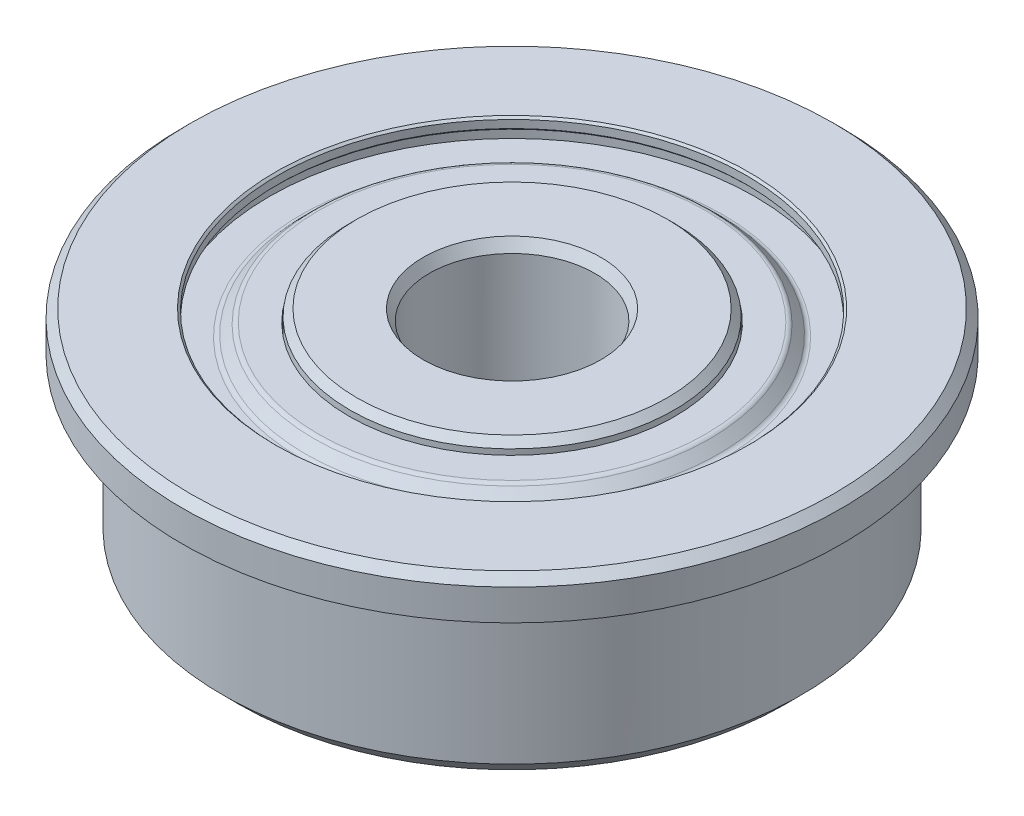
ISO-10303-21;
HEADER;
FILE_DESCRIPTION(('STEP AP214'),'2;1');
FILE_NAME('part.step','',(''),(''),'','','');
FILE_SCHEMA(('AUTOMOTIVE_DESIGN { 1 0 10303 214 1 1 1 1 }'));
ENDSEC;
DATA;
#1=APPLICATION_CONTEXT('core data for automotive mechanical design processes');
#2=APPLICATION_PROTOCOL_DEFINITION('international standard','automotive_design',2000,#1);
#3=PRODUCT_CONTEXT('',#1,'mechanical');
#4=PRODUCT('Part','Part','',(#3));
#5=PRODUCT_RELATED_PRODUCT_CATEGORY('part','',(#4));
#6=PRODUCT_DEFINITION_FORMATION('','',#4);
#7=PRODUCT_DEFINITION_CONTEXT('part definition',#1,'design');
#8=PRODUCT_DEFINITION('design','',#6,#7);
#9=PRODUCT_DEFINITION_SHAPE('','',#8);
#10=(LENGTH_UNIT() NAMED_UNIT(*) SI_UNIT(.MILLI.,.METRE.));
#11=(NAMED_UNIT(*) PLANE_ANGLE_UNIT() SI_UNIT($,.RADIAN.));
#12=(NAMED_UNIT(*) SI_UNIT($,.STERADIAN.) SOLID_ANGLE_UNIT());
#13=UNCERTAINTY_MEASURE_WITH_UNIT(LENGTH_MEASURE(1.E-05),#10,'distance_accuracy_value','');
#14=(GEOMETRIC_REPRESENTATION_CONTEXT(3) GLOBAL_UNCERTAINTY_ASSIGNED_CONTEXT((#13)) GLOBAL_UNIT_ASSIGNED_CONTEXT((#10,
#11,#12)) REPRESENTATION_CONTEXT('',''));
#15=CARTESIAN_POINT('',(0.,0.,0.));
#16=DIRECTION('',(0.,0.,1.));
#17=DIRECTION('',(1.,0.,0.));
#18=AXIS2_PLACEMENT_3D('',#15,#16,#17);
#19=CARTESIAN_POINT('',(0.,0.544,0.));
#20=DIRECTION('',(0.,-1.,0.));
#21=DIRECTION('',(0.,0.,-1.));
#22=AXIS2_PLACEMENT_3D('',#19,#20,#21);
#23=PLANE('',#22);
#24=CARTESIAN_POINT('',(0.,0.544,0.));
#25=DIRECTION('',(0.,-1.,0.));
#26=DIRECTION('',(0.,0.,-1.));
#27=AXIS2_PLACEMENT_3D('',#24,#25,#26);
#28=CIRCLE('',#27,3.94192694773615);
#29=CARTESIAN_POINT('',(0.,0.544,-3.94192694773615));
#30=VERTEX_POINT('',#29);
#31=EDGE_CURVE('E388',#30,#30,#28,.T.);
#32=ORIENTED_EDGE('',*,*,#31,.T.);
#33=EDGE_LOOP('',(#32));
#34=FACE_BOUND('',#33,.T.);
#35=CARTESIAN_POINT('',(0.,0.544,0.));
#36=DIRECTION('',(0.,-1.,0.));
#37=DIRECTION('',(0.,0.,-1.));
#38=AXIS2_PLACEMENT_3D('',#35,#36,#37);
#39=CIRCLE('',#38,3.92);
#40=CARTESIAN_POINT('',(0.,0.544,-3.92));
#41=VERTEX_POINT('',#40);
#42=EDGE_CURVE('E390',#41,#41,#39,.T.);
#43=ORIENTED_EDGE('',*,*,#42,.F.);
#44=EDGE_LOOP('',(#43));
#45=FACE_BOUND('',#44,.T.);
#46=ADVANCED_FACE('F16',(#34,#45),#23,.T.);
#47=CARTESIAN_POINT('',(0.,0.3,0.));
#48=DIRECTION('',(0.,-1.,0.));
#49=DIRECTION('',(0.,0.,-1.));
#50=AXIS2_PLACEMENT_3D('',#47,#48,#49);
#51=CYLINDRICAL_SURFACE('',#50,3.92);
#52=ORIENTED_EDGE('',*,*,#42,.T.);
#53=EDGE_LOOP('',(#52));
#54=FACE_BOUND('',#53,.T.);
#55=CARTESIAN_POINT('',(0.,0.170000000025539,0.));
#56=DIRECTION('',(0.,1.,0.));
#57=DIRECTION('',(0.,0.,1.));
#58=AXIS2_PLACEMENT_3D('',#55,#56,#57);
#59=CIRCLE('',#58,3.91999999999371);
#60=CARTESIAN_POINT('',(0.,0.170000000025539,3.91999999999371));
#61=VERTEX_POINT('',#60);
#62=EDGE_CURVE('E77',#61,#61,#59,.F.);
#63=ORIENTED_EDGE('',*,*,#62,.F.);
#64=EDGE_LOOP('',(#63));
#65=FACE_BOUND('',#64,.T.);
#66=ADVANCED_FACE('F114',(#54,#65),#51,.T.);
#67=CARTESIAN_POINT('',(0.,0.544,0.));
#68=DIRECTION('',(0.,-1.,0.));
#69=DIRECTION('',(0.,0.,-1.));
#70=AXIS2_PLACEMENT_3D('',#67,#68,#69);
#71=CYLINDRICAL_SURFACE('',#70,3.94192694773615);
#72=ORIENTED_EDGE('',*,*,#31,.F.);
#73=EDGE_LOOP('',(#72));
#74=FACE_BOUND('',#73,.T.);
#75=CARTESIAN_POINT('',(0.,0.3,0.));
#76=DIRECTION('',(0.,-1.,0.));
#77=DIRECTION('',(0.,0.,-1.));
#78=AXIS2_PLACEMENT_3D('',#75,#76,#77);
#79=CIRCLE('',#78,3.94192694773615);
#80=CARTESIAN_POINT('',(0.,0.3,-3.94192694773615));
#81=VERTEX_POINT('',#80);
#82=EDGE_CURVE('E385',#81,#81,#79,.F.);
#83=ORIENTED_EDGE('',*,*,#82,.F.);
#84=EDGE_LOOP('',(#83));
#85=FACE_BOUND('',#84,.T.);
#86=ADVANCED_FACE('F111',(#74,#85),#71,.F.);
#87=CARTESIAN_POINT('',(0.,0.170000000025539,0.));
#88=DIRECTION('',(0.,1.,0.));
#89=DIRECTION('',(0.,0.,1.));
#90=AXIS2_PLACEMENT_3D('',#87,#88,#89);
#91=CONICAL_SURFACE('',#90,3.91999999999371,0.785398163397448);
#92=CARTESIAN_POINT('',(0.,5.6843418860808E-11,0.));
#93=DIRECTION('',(0.,1.,0.));
#94=DIRECTION('',(0.,0.,1.));
#95=AXIS2_PLACEMENT_3D('',#92,#93,#94);
#96=CIRCLE('',#95,3.75000000002501);
#97=CARTESIAN_POINT('',(0.,5.6843418860808E-11,3.75000000002501));
#98=VERTEX_POINT('',#97);
#99=EDGE_CURVE('E63',#98,#98,#96,.T.);
#100=ORIENTED_EDGE('',*,*,#99,.T.);
#101=EDGE_LOOP('',(#100));
#102=FACE_BOUND('',#101,.T.);
#103=ORIENTED_EDGE('',*,*,#62,.T.);
#104=EDGE_LOOP('',(#103));
#105=FACE_BOUND('',#104,.T.);
#106=ADVANCED_FACE('F106',(#102,#105),#91,.T.);
#107=CARTESIAN_POINT('',(0.,0.3,0.));
#108=DIRECTION('',(0.,-1.,0.));
#109=DIRECTION('',(0.,0.,-1.));
#110=AXIS2_PLACEMENT_3D('',#107,#108,#109);
#111=PLANE('',#110);
#112=ORIENTED_EDGE('',*,*,#82,.T.);
#113=EDGE_LOOP('',(#112));
#114=FACE_BOUND('',#113,.T.);
#115=CARTESIAN_POINT('',(0.,0.3,0.));
#116=DIRECTION('',(0.,1.,0.));
#117=DIRECTION('',(0.,0.,1.));
#118=AXIS2_PLACEMENT_3D('',#115,#116,#117);
#119=CIRCLE('',#118,4.68490365463214);
#120=CARTESIAN_POINT('',(0.,0.3,4.68490365463214));
#121=VERTEX_POINT('',#120);
#122=CARTESIAN_POINT('',(0.,0.3,-4.68490365463214));
#123=VERTEX_POINT('',#122);
#124=EDGE_CURVE('E61',#121,#123,#119,.T.);
#125=ORIENTED_EDGE('',*,*,#124,.F.);
#126=CARTESIAN_POINT('',(0.,0.3,0.));
#127=DIRECTION('',(0.,1.,0.));
#128=DIRECTION('',(0.,0.,-1.));
#129=AXIS2_PLACEMENT_3D('',#126,#127,#128);
#130=CIRCLE('',#129,4.68490365463214);
#131=EDGE_CURVE('E56',#123,#121,#130,.T.);
#132=ORIENTED_EDGE('',*,*,#131,.F.);
#133=EDGE_LOOP('',(#125,#132));
#134=FACE_BOUND('',#133,.T.);
#135=ADVANCED_FACE('F60',(#114,#134),#111,.T.);
#136=CARTESIAN_POINT('',(0.,0.,0.));
#137=DIRECTION('',(0.,1.,0.));
#138=DIRECTION('',(0.,0.,1.));
#139=AXIS2_PLACEMENT_3D('',#136,#137,#138);
#140=PLANE('',#139);
#141=CARTESIAN_POINT('',(0.,5.6843418860808E-11,0.));
#142=DIRECTION('',(0.,-1.,0.));
#143=DIRECTION('',(0.,0.,-1.));
#144=AXIS2_PLACEMENT_3D('',#141,#142,#143);
#145=CIRCLE('',#144,2.1499999999719);
#146=CARTESIAN_POINT('',(0.,5.6843418860808E-11,-2.1499999999719));
#147=VERTEX_POINT('',#146);
#148=EDGE_CURVE('E69',#147,#147,#145,.F.);
#149=ORIENTED_EDGE('',*,*,#148,.T.);
#150=EDGE_LOOP('',(#149));
#151=FACE_BOUND('',#150,.T.);
#152=ORIENTED_EDGE('',*,*,#99,.F.);
#153=EDGE_LOOP('',(#152));
#154=FACE_BOUND('',#153,.T.);
#155=ADVANCED_FACE('F89',(#151,#154),#140,.F.);
#156=CARTESIAN_POINT('',(0.,0.45,0.));
#157=DIRECTION('',(0.,-1.,0.));
#158=DIRECTION('',(0.,0.,-1.));
#159=AXIS2_PLACEMENT_3D('',#156,#157,#158);
#160=TOROIDAL_SURFACE('',#159,4.68490365463214,0.15);
#161=ORIENTED_EDGE('',*,*,#131,.T.);
#162=ORIENTED_EDGE('',*,*,#124,.T.);
#163=EDGE_LOOP('',(#161,#162));
#164=FACE_BOUND('',#163,.T.);
#165=CARTESIAN_POINT('',(0.,0.343933982833278,0.));
#166=DIRECTION('',(0.,1.,0.));
#167=DIRECTION('',(0.,0.,1.));
#168=AXIS2_PLACEMENT_3D('',#165,#166,#167);
#169=CIRCLE('',#168,4.79096967177384);
#170=CARTESIAN_POINT('',(0.,0.343933982833278,4.79096967177384));
#171=VERTEX_POINT('',#170);
#172=EDGE_CURVE('E94',#171,#171,#169,.T.);
#173=ORIENTED_EDGE('',*,*,#172,.F.);
#174=EDGE_LOOP('',(#173));
#175=FACE_BOUND('',#174,.T.);
#176=ADVANCED_FACE('F67',(#164,#175),#160,.T.);
#177=CARTESIAN_POINT('',(0.,5.6843418860808E-11,0.));
#178=DIRECTION('',(0.,-1.,0.));
#179=DIRECTION('',(0.,0.,-1.));
#180=AXIS2_PLACEMENT_3D('',#177,#178,#179);
#181=CONICAL_SURFACE('',#180,2.1499999999719,0.523598775562543);
#182=CARTESIAN_POINT('',(0.,0.259807621135333,0.));
#183=DIRECTION('',(0.,1.,0.));
#184=DIRECTION('',(0.,0.,1.));
#185=AXIS2_PLACEMENT_3D('',#182,#183,#184);
#186=CIRCLE('',#185,2.);
#187=CARTESIAN_POINT('',(0.,0.259807621135333,2.));
#188=VERTEX_POINT('',#187);
#189=EDGE_CURVE('E368',#188,#188,#186,.T.);
#190=ORIENTED_EDGE('',*,*,#189,.T.);
#191=EDGE_LOOP('',(#190));
#192=FACE_BOUND('',#191,.T.);
#193=ORIENTED_EDGE('',*,*,#148,.F.);
#194=EDGE_LOOP('',(#193));
#195=FACE_BOUND('',#194,.T.);
#196=ADVANCED_FACE('F88',(#192,#195),#181,.F.);
#197=CARTESIAN_POINT('',(0.,0.546066017193425,0.));
#198=DIRECTION('',(0.,1.,0.));
#199=DIRECTION('',(0.,0.,1.));
#200=AXIS2_PLACEMENT_3D('',#197,#198,#199);
#201=CONICAL_SURFACE('',#200,4.99310170607714,0.785398163256839);
#202=CARTESIAN_POINT('',(0.,0.546066017177981,0.));
#203=DIRECTION('',(0.,-1.,0.));
#204=DIRECTION('',(0.,0.,-1.));
#205=AXIS2_PLACEMENT_3D('',#202,#203,#204);
#206=CIRCLE('',#205,4.99310170616609);
#207=CARTESIAN_POINT('',(0.,0.546066017177981,-4.99310170616609));
#208=VERTEX_POINT('',#207);
#209=EDGE_CURVE('E366',#208,#208,#206,.T.);
#210=ORIENTED_EDGE('',*,*,#209,.T.);
#211=EDGE_LOOP('',(#210));
#212=FACE_BOUND('',#211,.T.);
#213=ORIENTED_EDGE('',*,*,#172,.T.);
#214=EDGE_LOOP('',(#213));
#215=FACE_BOUND('',#214,.T.);
#216=ADVANCED_FACE('F418',(#212,#215),#201,.T.);
#217=CARTESIAN_POINT('',(0.,0.,0.));
#218=DIRECTION('',(0.,1.,0.));
#219=DIRECTION('',(0.,0.,1.));
#220=AXIS2_PLACEMENT_3D('',#217,#218,#219);
#221=CYLINDRICAL_SURFACE('',#220,2.);
#222=ORIENTED_EDGE('',*,*,#189,.F.);
#223=EDGE_LOOP('',(#222));
#224=FACE_BOUND('',#223,.T.);
#225=CARTESIAN_POINT('',(0.,4.74019237884704,0.));
#226=DIRECTION('',(0.,1.,0.));
#227=DIRECTION('',(0.,0.,1.));
#228=AXIS2_PLACEMENT_3D('',#225,#226,#227);
#229=CIRCLE('',#228,1.99999999995271);
#230=CARTESIAN_POINT('',(0.,4.74019237884704,1.99999999995271));
#231=VERTEX_POINT('',#230);
#232=EDGE_CURVE('E358',#231,#231,#229,.T.);
#233=ORIENTED_EDGE('',*,*,#232,.T.);
#234=EDGE_LOOP('',(#233));
#235=FACE_BOUND('',#234,.T.);
#236=ADVANCED_FACE('F345',(#224,#235),#221,.F.);
#237=CARTESIAN_POINT('',(0.,0.44,0.));
#238=DIRECTION('',(0.,-1.,0.));
#239=DIRECTION('',(0.,0.,-1.));
#240=AXIS2_PLACEMENT_3D('',#237,#238,#239);
#241=TOROIDAL_SURFACE('',#240,5.09916772334407,0.15);
#242=ORIENTED_EDGE('',*,*,#209,.F.);
#243=EDGE_LOOP('',(#242));
#244=FACE_BOUND('',#243,.T.);
#245=CARTESIAN_POINT('',(0.,0.59,0.));
#246=DIRECTION('',(0.,-1.,0.));
#247=DIRECTION('',(0.,0.,1.));
#248=AXIS2_PLACEMENT_3D('',#245,#246,#247);
#249=CIRCLE('',#248,5.09916772334407);
#250=CARTESIAN_POINT('',(0.,0.59,-5.09916772334407));
#251=VERTEX_POINT('',#250);
#252=CARTESIAN_POINT('',(0.,0.59,5.09916772334407));
#253=VERTEX_POINT('',#252);
#254=EDGE_CURVE('E308',#251,#253,#249,.F.);
#255=ORIENTED_EDGE('',*,*,#254,.F.);
#256=CARTESIAN_POINT('',(0.,0.59,0.));
#257=DIRECTION('',(0.,-1.,0.));
#258=DIRECTION('',(0.,0.,-1.));
#259=AXIS2_PLACEMENT_3D('',#256,#257,#258);
#260=CIRCLE('',#259,5.09916772334407);
#261=EDGE_CURVE('E764',#253,#251,#260,.F.);
#262=ORIENTED_EDGE('',*,*,#261,.F.);
#263=EDGE_LOOP('',(#255,#262));
#264=FACE_BOUND('',#263,.T.);
#265=ADVANCED_FACE('F341',(#244,#264),#241,.F.);
#266=CARTESIAN_POINT('',(0.,4.99999999999545,0.));
#267=DIRECTION('',(0.,1.,0.));
#268=DIRECTION('',(0.,0.,1.));
#269=AXIS2_PLACEMENT_3D('',#266,#267,#268);
#270=CONICAL_SURFACE('',#269,2.1499999999719,0.523598775631897);
#271=ORIENTED_EDGE('',*,*,#232,.F.);
#272=EDGE_LOOP('',(#271));
#273=FACE_BOUND('',#272,.T.);
#274=CARTESIAN_POINT('',(0.,4.99999999999545,0.));
#275=DIRECTION('',(0.,1.,0.));
#276=DIRECTION('',(0.,0.,1.));
#277=AXIS2_PLACEMENT_3D('',#274,#275,#276);
#278=CIRCLE('',#277,2.1499999999719);
#279=CARTESIAN_POINT('',(0.,4.99999999999545,2.1499999999719));
#280=VERTEX_POINT('',#279);
#281=EDGE_CURVE('E381',#280,#280,#278,.F.);
#282=ORIENTED_EDGE('',*,*,#281,.F.);
#283=EDGE_LOOP('',(#282));
#284=FACE_BOUND('',#283,.T.);
#285=ADVANCED_FACE('F325',(#273,#284),#270,.F.);
#286=CARTESIAN_POINT('',(0.,0.59,0.));
#287=DIRECTION('',(0.,-1.,0.));
#288=DIRECTION('',(0.,0.,-1.));
#289=AXIS2_PLACEMENT_3D('',#286,#287,#288);
#290=PLANE('',#289);
#291=CARTESIAN_POINT('',(0.,0.59,0.));
#292=DIRECTION('',(0.,-1.,0.));
#293=DIRECTION('',(0.,0.,-1.));
#294=AXIS2_PLACEMENT_3D('',#291,#292,#293);
#295=CIRCLE('',#294,5.875);
#296=CARTESIAN_POINT('',(0.,0.59,-5.875));
#297=VERTEX_POINT('',#296);
#298=EDGE_CURVE('E760',#297,#297,#295,.T.);
#299=ORIENTED_EDGE('',*,*,#298,.T.);
#300=EDGE_LOOP('',(#299));
#301=FACE_BOUND('',#300,.T.);
#302=ORIENTED_EDGE('',*,*,#254,.T.);
#303=ORIENTED_EDGE('',*,*,#261,.T.);
#304=EDGE_LOOP('',(#302,#303));
#305=FACE_BOUND('',#304,.T.);
#306=ADVANCED_FACE('F314',(#301,#305),#290,.T.);
#307=CARTESIAN_POINT('',(0.,5.,0.));
#308=DIRECTION('',(0.,1.,0.));
#309=DIRECTION('',(0.,0.,1.));
#310=AXIS2_PLACEMENT_3D('',#307,#308,#309);
#311=PLANE('',#310);
#312=ORIENTED_EDGE('',*,*,#281,.T.);
#313=EDGE_LOOP('',(#312));
#314=FACE_BOUND('',#313,.T.);
#315=CARTESIAN_POINT('',(0.,5.0000000000523,0.));
#316=DIRECTION('',(0.,-1.,0.));
#317=DIRECTION('',(0.,0.,-1.));
#318=AXIS2_PLACEMENT_3D('',#315,#316,#317);
#319=CIRCLE('',#318,3.74999999996817);
#320=CARTESIAN_POINT('',(0.,5.0000000000523,-3.74999999996817));
#321=VERTEX_POINT('',#320);
#322=EDGE_CURVE('E758',#321,#321,#319,.T.);
#323=ORIENTED_EDGE('',*,*,#322,.F.);
#324=EDGE_LOOP('',(#323));
#325=FACE_BOUND('',#324,.T.);
#326=ADVANCED_FACE('F324',(#314,#325),#311,.T.);
#327=CARTESIAN_POINT('',(0.,0.59,0.));
#328=DIRECTION('',(0.,-1.,0.));
#329=DIRECTION('',(0.,0.,-1.));
#330=AXIS2_PLACEMENT_3D('',#327,#328,#329);
#331=CYLINDRICAL_SURFACE('',#330,5.875);
#332=CARTESIAN_POINT('',(0.,0.29,0.));
#333=DIRECTION('',(0.,-1.,0.));
#334=DIRECTION('',(0.,0.,-1.));
#335=AXIS2_PLACEMENT_3D('',#332,#333,#334);
#336=CIRCLE('',#335,5.875);
#337=CARTESIAN_POINT('',(0.,0.29,-5.875));
#338=VERTEX_POINT('',#337);
#339=EDGE_CURVE('E303',#338,#338,#336,.T.);
#340=ORIENTED_EDGE('',*,*,#339,.T.);
#341=EDGE_LOOP('',(#340));
#342=FACE_BOUND('',#341,.T.);
#343=ORIENTED_EDGE('',*,*,#298,.F.);
#344=EDGE_LOOP('',(#343));
#345=FACE_BOUND('',#344,.T.);
#346=ADVANCED_FACE('F450',(#342,#345),#331,.F.);
#347=CARTESIAN_POINT('',(0.,4.82999999996991,0.));
#348=DIRECTION('',(0.,-1.,0.));
#349=DIRECTION('',(0.,0.,-1.));
#350=AXIS2_PLACEMENT_3D('',#347,#348,#349);
#351=CONICAL_SURFACE('',#350,3.92000000005055,0.785398163397448);
#352=CARTESIAN_POINT('',(0.,4.83,0.));
#353=DIRECTION('',(0.,1.,0.));
#354=DIRECTION('',(0.,0.,1.));
#355=AXIS2_PLACEMENT_3D('',#352,#353,#354);
#356=CIRCLE('',#355,3.92);
#357=CARTESIAN_POINT('',(0.,4.83,3.92));
#358=VERTEX_POINT('',#357);
#359=EDGE_CURVE('E299',#358,#358,#356,.F.);
#360=ORIENTED_EDGE('',*,*,#359,.F.);
#361=EDGE_LOOP('',(#360));
#362=FACE_BOUND('',#361,.T.);
#363=ORIENTED_EDGE('',*,*,#322,.T.);
#364=EDGE_LOOP('',(#363));
#365=FACE_BOUND('',#364,.T.);
#366=ADVANCED_FACE('F457',(#362,#365),#351,.T.);
#367=CARTESIAN_POINT('',(0.,0.29,0.));
#368=DIRECTION('',(0.,-1.,0.));
#369=DIRECTION('',(0.,0.,-1.));
#370=AXIS2_PLACEMENT_3D('',#367,#368,#369);
#371=PLANE('',#370);
#372=ORIENTED_EDGE('',*,*,#339,.F.);
#373=EDGE_LOOP('',(#372));
#374=FACE_BOUND('',#373,.T.);
#375=CARTESIAN_POINT('',(0.,0.290000000006785,0.));
#376=DIRECTION('',(0.,1.,0.));
#377=DIRECTION('',(0.,0.,1.));
#378=AXIS2_PLACEMENT_3D('',#375,#376,#377);
#379=CIRCLE('',#378,5.72499999998399);
#380=CARTESIAN_POINT('',(0.,0.290000000006785,5.72499999998399));
#381=VERTEX_POINT('',#380);
#382=EDGE_CURVE('E302',#381,#381,#379,.F.);
#383=ORIENTED_EDGE('',*,*,#382,.T.);
#384=EDGE_LOOP('',(#383));
#385=FACE_BOUND('',#384,.T.);
#386=ADVANCED_FACE('F464',(#374,#385),#371,.F.);
#387=CARTESIAN_POINT('',(0.,4.71,0.));
#388=DIRECTION('',(0.,1.,0.));
#389=DIRECTION('',(0.,0.,1.));
#390=AXIS2_PLACEMENT_3D('',#387,#388,#389);
#391=CYLINDRICAL_SURFACE('',#390,3.92);
#392=ORIENTED_EDGE('',*,*,#359,.T.);
#393=EDGE_LOOP('',(#392));
#394=FACE_BOUND('',#393,.T.);
#395=CARTESIAN_POINT('',(0.,4.456,0.));
#396=DIRECTION('',(0.,1.,0.));
#397=DIRECTION('',(0.,0.,1.));
#398=AXIS2_PLACEMENT_3D('',#395,#396,#397);
#399=CIRCLE('',#398,3.92);
#400=CARTESIAN_POINT('',(0.,4.456,3.92));
#401=VERTEX_POINT('',#400);
#402=EDGE_CURVE('E298',#401,#401,#399,.F.);
#403=ORIENTED_EDGE('',*,*,#402,.F.);
#404=EDGE_LOOP('',(#403));
#405=FACE_BOUND('',#404,.T.);
#406=ADVANCED_FACE('F472',(#394,#405),#391,.T.);
#407=CARTESIAN_POINT('',(0.,0.290000000006785,0.));
#408=DIRECTION('',(0.,1.,0.));
#409=DIRECTION('',(0.,0.,1.));
#410=AXIS2_PLACEMENT_3D('',#407,#408,#409);
#411=CONICAL_SURFACE('',#410,5.72499999998399,0.785398163397448);
#412=ORIENTED_EDGE('',*,*,#382,.F.);
#413=EDGE_LOOP('',(#412));
#414=FACE_BOUND('',#413,.T.);
#415=CARTESIAN_POINT('',(0.,0.240000000000004,0.));
#416=DIRECTION('',(0.,-1.,0.));
#417=DIRECTION('',(0.,0.,-1.));
#418=AXIS2_PLACEMENT_3D('',#415,#416,#417);
#419=CIRCLE('',#418,5.675);
#420=CARTESIAN_POINT('',(0.,0.240000000000004,-5.675));
#421=VERTEX_POINT('',#420);
#422=EDGE_CURVE('E295',#421,#421,#419,.T.);
#423=ORIENTED_EDGE('',*,*,#422,.T.);
#424=EDGE_LOOP('',(#423));
#425=FACE_BOUND('',#424,.T.);
#426=ADVANCED_FACE('F480',(#414,#425),#411,.F.);
#427=CARTESIAN_POINT('',(0.,4.456,0.));
#428=DIRECTION('',(0.,1.,0.));
#429=DIRECTION('',(0.,0.,1.));
#430=AXIS2_PLACEMENT_3D('',#427,#428,#429);
#431=PLANE('',#430);
#432=CARTESIAN_POINT('',(0.,4.456,0.));
#433=DIRECTION('',(0.,1.,0.));
#434=DIRECTION('',(0.,0.,1.));
#435=AXIS2_PLACEMENT_3D('',#432,#433,#434);
#436=CIRCLE('',#435,3.94192694773615);
#437=CARTESIAN_POINT('',(0.,4.456,3.94192694773615));
#438=VERTEX_POINT('',#437);
#439=EDGE_CURVE('E294',#438,#438,#436,.T.);
#440=ORIENTED_EDGE('',*,*,#439,.T.);
#441=EDGE_LOOP('',(#440));
#442=FACE_BOUND('',#441,.T.);
#443=ORIENTED_EDGE('',*,*,#402,.T.);
#444=EDGE_LOOP('',(#443));
#445=FACE_BOUND('',#444,.T.);
#446=ADVANCED_FACE('F488',(#442,#445),#431,.T.);
#447=CARTESIAN_POINT('',(0.,0.3,0.));
#448=DIRECTION('',(0.,-1.,0.));
#449=DIRECTION('',(0.,0.,-1.));
#450=AXIS2_PLACEMENT_3D('',#447,#448,#449);
#451=CYLINDRICAL_SURFACE('',#450,5.675);
#452=CARTESIAN_POINT('',(0.,0.049999999987449,0.));
#453=DIRECTION('',(0.,-1.,0.));
#454=DIRECTION('',(0.,0.,-1.));
#455=AXIS2_PLACEMENT_3D('',#452,#453,#454);
#456=CIRCLE('',#455,5.67500000005339);
#457=CARTESIAN_POINT('',(0.,0.049999999987449,-5.67500000005339));
#458=VERTEX_POINT('',#457);
#459=EDGE_CURVE('E285',#458,#458,#456,.T.);
#460=ORIENTED_EDGE('',*,*,#459,.T.);
#461=EDGE_LOOP('',(#460));
#462=FACE_BOUND('',#461,.T.);
#463=ORIENTED_EDGE('',*,*,#422,.F.);
#464=EDGE_LOOP('',(#463));
#465=FACE_BOUND('',#464,.T.);
#466=ADVANCED_FACE('F496',(#462,#465),#451,.F.);
#467=CARTESIAN_POINT('',(0.,4.456,0.));
#468=DIRECTION('',(0.,1.,0.));
#469=DIRECTION('',(0.,0.,1.));
#470=AXIS2_PLACEMENT_3D('',#467,#468,#469);
#471=CYLINDRICAL_SURFACE('',#470,3.94192694773615);
#472=CARTESIAN_POINT('',(0.,4.71,0.));
#473=DIRECTION('',(0.,1.,0.));
#474=DIRECTION('',(0.,0.,1.));
#475=AXIS2_PLACEMENT_3D('',#472,#473,#474);
#476=CIRCLE('',#475,3.94192694773615);
#477=CARTESIAN_POINT('',(0.,4.71,3.94192694773615));
#478=VERTEX_POINT('',#477);
#479=EDGE_CURVE('E293',#478,#478,#476,.F.);
#480=ORIENTED_EDGE('',*,*,#479,.F.);
#481=EDGE_LOOP('',(#480));
#482=FACE_BOUND('',#481,.T.);
#483=ORIENTED_EDGE('',*,*,#439,.F.);
#484=EDGE_LOOP('',(#483));
#485=FACE_BOUND('',#484,.T.);
#486=ADVANCED_FACE('F504',(#482,#485),#471,.F.);
#487=CARTESIAN_POINT('',(0.,0.,0.));
#488=DIRECTION('',(0.,-1.,0.));
#489=DIRECTION('',(0.,0.,-1.));
#490=AXIS2_PLACEMENT_3D('',#487,#488,#489);
#491=CONICAL_SURFACE('',#490,5.72499999998399,0.785398162829014);
#492=CARTESIAN_POINT('',(0.,0.,0.));
#493=DIRECTION('',(0.,-1.,0.));
#494=DIRECTION('',(0.,0.,-1.));
#495=AXIS2_PLACEMENT_3D('',#492,#493,#494);
#496=CIRCLE('',#495,5.72499999998399);
#497=CARTESIAN_POINT('',(0.,0.,-5.72499999998399));
#498=VERTEX_POINT('',#497);
#499=EDGE_CURVE('E745',#498,#498,#496,.T.);
#500=ORIENTED_EDGE('',*,*,#499,.T.);
#501=EDGE_LOOP('',(#500));
#502=FACE_BOUND('',#501,.T.);
#503=ORIENTED_EDGE('',*,*,#459,.F.);
#504=EDGE_LOOP('',(#503));
#505=FACE_BOUND('',#504,.T.);
#506=ADVANCED_FACE('F271',(#502,#505),#491,.F.);
#507=CARTESIAN_POINT('',(0.,4.71,0.));
#508=DIRECTION('',(0.,1.,0.));
#509=DIRECTION('',(0.,0.,1.));
#510=AXIS2_PLACEMENT_3D('',#507,#508,#509);
#511=PLANE('',#510);
#512=CARTESIAN_POINT('',(0.,4.71,0.));
#513=DIRECTION('',(0.,-1.,0.));
#514=DIRECTION('',(0.,0.,-1.));
#515=AXIS2_PLACEMENT_3D('',#512,#513,#514);
#516=CIRCLE('',#515,4.68490365463215);
#517=CARTESIAN_POINT('',(0.,4.71,-4.68490365463215));
#518=VERTEX_POINT('',#517);
#519=CARTESIAN_POINT('',(0.,4.71,4.68490365463215));
#520=VERTEX_POINT('',#519);
#521=EDGE_CURVE('E257',#518,#520,#516,.T.);
#522=ORIENTED_EDGE('',*,*,#521,.F.);
#523=CARTESIAN_POINT('',(0.,4.71,0.));
#524=DIRECTION('',(0.,-1.,0.));
#525=DIRECTION('',(0.,0.,1.));
#526=AXIS2_PLACEMENT_3D('',#523,#524,#525);
#527=CIRCLE('',#526,4.68490365463215);
#528=EDGE_CURVE('E227',#520,#518,#527,.T.);
#529=ORIENTED_EDGE('',*,*,#528,.F.);
#530=EDGE_LOOP('',(#522,#529));
#531=FACE_BOUND('',#530,.T.);
#532=ORIENTED_EDGE('',*,*,#479,.T.);
#533=EDGE_LOOP('',(#532));
#534=FACE_BOUND('',#533,.T.);
#535=ADVANCED_FACE('F262',(#531,#534),#511,.T.);
#536=CARTESIAN_POINT('',(0.,0.,0.));
#537=DIRECTION('',(0.,1.,0.));
#538=DIRECTION('',(0.,0.,1.));
#539=AXIS2_PLACEMENT_3D('',#536,#537,#538);
#540=PLANE('',#539);
#541=CARTESIAN_POINT('',(0.,0.,0.));
#542=DIRECTION('',(0.,1.,0.));
#543=DIRECTION('',(-1.,0.,0.));
#544=AXIS2_PLACEMENT_3D('',#541,#542,#543);
#545=CIRCLE('',#544,6.6);
#546=CARTESIAN_POINT('',(-6.6,0.,0.));
#547=VERTEX_POINT('',#546);
#548=EDGE_CURVE('E742',#547,#547,#545,.T.);
#549=ORIENTED_EDGE('',*,*,#548,.F.);
#550=EDGE_LOOP('',(#549));
#551=FACE_BOUND('',#550,.T.);
#552=ORIENTED_EDGE('',*,*,#499,.F.);
#553=EDGE_LOOP('',(#552));
#554=FACE_BOUND('',#553,.T.);
#555=ADVANCED_FACE('F246',(#551,#554),#540,.F.);
#556=CARTESIAN_POINT('',(0.,4.56,0.));
#557=DIRECTION('',(0.,1.,0.));
#558=DIRECTION('',(0.,0.,1.));
#559=AXIS2_PLACEMENT_3D('',#556,#557,#558);
#560=TOROIDAL_SURFACE('',#559,4.68490365463215,0.15);
#561=ORIENTED_EDGE('',*,*,#528,.T.);
#562=ORIENTED_EDGE('',*,*,#521,.T.);
#563=EDGE_LOOP('',(#561,#562));
#564=FACE_BOUND('',#563,.T.);
#565=CARTESIAN_POINT('',(0.,4.66606601725061,0.));
#566=DIRECTION('',(0.,-1.,0.));
#567=DIRECTION('',(0.,0.,-1.));
#568=AXIS2_PLACEMENT_3D('',#565,#566,#567);
#569=CIRCLE('',#568,4.79096967177384);
#570=CARTESIAN_POINT('',(0.,4.66606601725061,-4.79096967177384));
#571=VERTEX_POINT('',#570);
#572=EDGE_CURVE('E253',#571,#571,#569,.T.);
#573=ORIENTED_EDGE('',*,*,#572,.F.);
#574=EDGE_LOOP('',(#573));
#575=FACE_BOUND('',#574,.T.);
#576=ADVANCED_FACE('F234',(#564,#575),#560,.T.);
#577=CARTESIAN_POINT('',(0.,0.400000000000002,0.));
#578=DIRECTION('',(0.,1.,0.));
#579=DIRECTION('',(-1.,0.,0.));
#580=AXIS2_PLACEMENT_3D('',#577,#578,#579);
#581=CONICAL_SURFACE('',#580,7.,0.78539816339745);
#582=CARTESIAN_POINT('',(0.,0.400000000000002,0.));
#583=DIRECTION('',(0.,-1.,0.));
#584=DIRECTION('',(0.,0.,-1.));
#585=AXIS2_PLACEMENT_3D('',#582,#583,#584);
#586=CIRCLE('',#585,7.);
#587=CARTESIAN_POINT('',(0.,0.400000000000002,-7.));
#588=VERTEX_POINT('',#587);
#589=EDGE_CURVE('E738',#588,#588,#586,.F.);
#590=ORIENTED_EDGE('',*,*,#589,.F.);
#591=EDGE_LOOP('',(#590));
#592=FACE_BOUND('',#591,.T.);
#593=ORIENTED_EDGE('',*,*,#548,.T.);
#594=EDGE_LOOP('',(#593));
#595=FACE_BOUND('',#594,.T.);
#596=ADVANCED_FACE('F245',(#592,#595),#581,.T.);
#597=CARTESIAN_POINT('',(0.,4.45393398285887,0.));
#598=DIRECTION('',(0.,-1.,0.));
#599=DIRECTION('',(0.,0.,-1.));
#600=AXIS2_PLACEMENT_3D('',#597,#598,#599);
#601=CONICAL_SURFACE('',#600,5.00310170616558,0.785398163397448);
#602=CARTESIAN_POINT('',(0.,4.45393398282202,0.));
#603=DIRECTION('',(0.,1.,0.));
#604=DIRECTION('',(0.,0.,1.));
#605=AXIS2_PLACEMENT_3D('',#602,#603,#604);
#606=CIRCLE('',#605,5.00310170616609);
#607=CARTESIAN_POINT('',(0.,4.45393398282202,5.00310170616609));
#608=VERTEX_POINT('',#607);
#609=EDGE_CURVE('E735',#608,#608,#606,.T.);
#610=ORIENTED_EDGE('',*,*,#609,.T.);
#611=EDGE_LOOP('',(#610));
#612=FACE_BOUND('',#611,.T.);
#613=ORIENTED_EDGE('',*,*,#572,.T.);
#614=EDGE_LOOP('',(#613));
#615=FACE_BOUND('',#614,.T.);
#616=ADVANCED_FACE('F538',(#612,#615),#601,.T.);
#617=CARTESIAN_POINT('',(0.,4.05,0.));
#618=DIRECTION('',(0.,-1.,0.));
#619=DIRECTION('',(0.,0.,-1.));
#620=AXIS2_PLACEMENT_3D('',#617,#618,#619);
#621=CYLINDRICAL_SURFACE('',#620,7.);
#622=ORIENTED_EDGE('',*,*,#589,.T.);
#623=EDGE_LOOP('',(#622));
#624=FACE_BOUND('',#623,.T.);
#625=CARTESIAN_POINT('',(0.,3.75,0.));
#626=DIRECTION('',(0.,-1.,0.));
#627=DIRECTION('',(0.,0.,-1.));
#628=AXIS2_PLACEMENT_3D('',#625,#626,#627);
#629=CIRCLE('',#628,7.);
#630=CARTESIAN_POINT('',(0.,3.75,-7.));
#631=VERTEX_POINT('',#630);
#632=EDGE_CURVE('E732',#631,#631,#629,.F.);
#633=ORIENTED_EDGE('',*,*,#632,.F.);
#634=EDGE_LOOP('',(#633));
#635=FACE_BOUND('',#634,.T.);
#636=ADVANCED_FACE('F206',(#624,#635),#621,.T.);
#637=CARTESIAN_POINT('',(0.,4.56,0.));
#638=DIRECTION('',(0.,1.,0.));
#639=DIRECTION('',(0.,0.,1.));
#640=AXIS2_PLACEMENT_3D('',#637,#638,#639);
#641=TOROIDAL_SURFACE('',#640,5.10916772334407,0.15);
#642=ORIENTED_EDGE('',*,*,#609,.F.);
#643=EDGE_LOOP('',(#642));
#644=FACE_BOUND('',#643,.T.);
#645=CARTESIAN_POINT('',(0.,4.41,0.));
#646=DIRECTION('',(0.,1.,0.));
#647=DIRECTION('',(0.,0.,-1.));
#648=AXIS2_PLACEMENT_3D('',#645,#646,#647);
#649=CIRCLE('',#648,5.10916772334407);
#650=CARTESIAN_POINT('',(0.,4.41,5.10916772334407));
#651=VERTEX_POINT('',#650);
#652=CARTESIAN_POINT('',(0.,4.41,-5.10916772334407));
#653=VERTEX_POINT('',#652);
#654=EDGE_CURVE('E734',#651,#653,#649,.F.);
#655=ORIENTED_EDGE('',*,*,#654,.F.);
#656=CARTESIAN_POINT('',(0.,4.41,0.));
#657=DIRECTION('',(0.,1.,0.));
#658=DIRECTION('',(0.,0.,1.));
#659=AXIS2_PLACEMENT_3D('',#656,#657,#658);
#660=CIRCLE('',#659,5.10916772334407);
#661=EDGE_CURVE('E35',#653,#651,#660,.F.);
#662=ORIENTED_EDGE('',*,*,#661,.F.);
#663=EDGE_LOOP('',(#655,#662));
#664=FACE_BOUND('',#663,.T.);
#665=ADVANCED_FACE('F202',(#644,#664),#641,.F.);
#666=CARTESIAN_POINT('',(7.,3.75,0.));
#667=DIRECTION('',(0.,1.,0.));
#668=DIRECTION('',(0.,0.,1.));
#669=AXIS2_PLACEMENT_3D('',#666,#667,#668);
#670=PLANE('',#669);
#671=CARTESIAN_POINT('',(0.,3.75,0.));
#672=DIRECTION('',(0.,1.,0.));
#673=DIRECTION('',(0.,0.,1.));
#674=AXIS2_PLACEMENT_3D('',#671,#672,#673);
#675=CIRCLE('',#674,6.8);
#676=CARTESIAN_POINT('',(0.,3.75,6.8));
#677=VERTEX_POINT('',#676);
#678=EDGE_CURVE('E729',#677,#677,#675,.T.);
#679=ORIENTED_EDGE('',*,*,#678,.F.);
#680=EDGE_LOOP('',(#679));
#681=FACE_BOUND('',#680,.T.);
#682=ORIENTED_EDGE('',*,*,#632,.T.);
#683=EDGE_LOOP('',(#682));
#684=FACE_BOUND('',#683,.T.);
#685=ADVANCED_FACE('F182',(#681,#684),#670,.T.);
#686=CARTESIAN_POINT('',(0.,4.41,0.));
#687=DIRECTION('',(0.,1.,0.));
#688=DIRECTION('',(0.,0.,1.));
#689=AXIS2_PLACEMENT_3D('',#686,#687,#688);
#690=PLANE('',#689);
#691=CARTESIAN_POINT('',(0.,4.41,0.));
#692=DIRECTION('',(0.,1.,0.));
#693=DIRECTION('',(0.,0.,1.));
#694=AXIS2_PLACEMENT_3D('',#691,#692,#693);
#695=CIRCLE('',#694,5.875);
#696=CARTESIAN_POINT('',(0.,4.41,5.875));
#697=VERTEX_POINT('',#696);
#698=EDGE_CURVE('E797',#697,#697,#695,.T.);
#699=ORIENTED_EDGE('',*,*,#698,.T.);
#700=EDGE_LOOP('',(#699));
#701=FACE_BOUND('',#700,.T.);
#702=ORIENTED_EDGE('',*,*,#654,.T.);
#703=ORIENTED_EDGE('',*,*,#661,.T.);
#704=EDGE_LOOP('',(#702,#703));
#705=FACE_BOUND('',#704,.T.);
#706=ADVANCED_FACE('F177',(#701,#705),#690,.T.);
#707=CARTESIAN_POINT('',(0.,0.,0.));
#708=DIRECTION('',(0.,1.,0.));
#709=DIRECTION('',(0.,0.,1.));
#710=AXIS2_PLACEMENT_3D('',#707,#708,#709);
#711=CYLINDRICAL_SURFACE('',#710,6.8);
#712=CARTESIAN_POINT('',(0.,4.15,0.));
#713=DIRECTION('',(0.,1.,0.));
#714=DIRECTION('',(0.,0.,1.));
#715=AXIS2_PLACEMENT_3D('',#712,#713,#714);
#716=CIRCLE('',#715,6.8);
#717=CARTESIAN_POINT('',(0.,4.15,6.8));
#718=VERTEX_POINT('',#717);
#719=EDGE_CURVE('E800',#718,#718,#716,.T.);
#720=ORIENTED_EDGE('',*,*,#719,.F.);
#721=EDGE_LOOP('',(#720));
#722=FACE_BOUND('',#721,.T.);
#723=ORIENTED_EDGE('',*,*,#678,.T.);
#724=EDGE_LOOP('',(#723));
#725=FACE_BOUND('',#724,.T.);
#726=ADVANCED_FACE('F173',(#722,#725),#711,.T.);
#727=CARTESIAN_POINT('',(0.,4.41,0.));
#728=DIRECTION('',(0.,1.,0.));
#729=DIRECTION('',(0.,0.,1.));
#730=AXIS2_PLACEMENT_3D('',#727,#728,#729);
#731=CYLINDRICAL_SURFACE('',#730,5.875);
#732=ORIENTED_EDGE('',*,*,#698,.F.);
#733=EDGE_LOOP('',(#732));
#734=FACE_BOUND('',#733,.T.);
#735=CARTESIAN_POINT('',(0.,4.71,0.));
#736=DIRECTION('',(0.,1.,0.));
#737=DIRECTION('',(0.,0.,1.));
#738=AXIS2_PLACEMENT_3D('',#735,#736,#737);
#739=CIRCLE('',#738,5.875);
#740=CARTESIAN_POINT('',(0.,4.71,5.875));
#741=VERTEX_POINT('',#740);
#742=EDGE_CURVE('E803',#741,#741,#739,.T.);
#743=ORIENTED_EDGE('',*,*,#742,.T.);
#744=EDGE_LOOP('',(#743));
#745=FACE_BOUND('',#744,.T.);
#746=ADVANCED_FACE('F169',(#734,#745),#731,.F.);
#747=CARTESIAN_POINT('',(0.,4.15,0.));
#748=DIRECTION('',(0.,-1.,0.));
#749=DIRECTION('',(0.,0.,-1.));
#750=AXIS2_PLACEMENT_3D('',#747,#748,#749);
#751=PLANE('',#750);
#752=CARTESIAN_POINT('',(0.,4.15,0.));
#753=DIRECTION('',(0.,-1.,0.));
#754=DIRECTION('',(0.,0.,-1.));
#755=AXIS2_PLACEMENT_3D('',#752,#753,#754);
#756=CIRCLE('',#755,7.3);
#757=CARTESIAN_POINT('',(0.,4.15,-7.3));
#758=VERTEX_POINT('',#757);
#759=EDGE_CURVE('E806',#758,#758,#756,.T.);
#760=ORIENTED_EDGE('',*,*,#759,.T.);
#761=EDGE_LOOP('',(#760));
#762=FACE_BOUND('',#761,.T.);
#763=ORIENTED_EDGE('',*,*,#719,.T.);
#764=EDGE_LOOP('',(#763));
#765=FACE_BOUND('',#764,.T.);
#766=ADVANCED_FACE('F165',(#762,#765),#751,.T.);
#767=CARTESIAN_POINT('',(0.,4.71,0.));
#768=DIRECTION('',(0.,1.,0.));
#769=DIRECTION('',(0.,0.,1.));
#770=AXIS2_PLACEMENT_3D('',#767,#768,#769);
#771=PLANE('',#770);
#772=ORIENTED_EDGE('',*,*,#742,.F.);
#773=EDGE_LOOP('',(#772));
#774=FACE_BOUND('',#773,.T.);
#775=CARTESIAN_POINT('',(0.,4.70999999998867,0.));
#776=DIRECTION('',(0.,-1.,0.));
#777=DIRECTION('',(0.,0.,-1.));
#778=AXIS2_PLACEMENT_3D('',#775,#776,#777);
#779=CIRCLE('',#778,5.72499999998399);
#780=CARTESIAN_POINT('',(0.,4.70999999998867,-5.72499999998399));
#781=VERTEX_POINT('',#780);
#782=EDGE_CURVE('E809',#781,#781,#779,.F.);
#783=ORIENTED_EDGE('',*,*,#782,.T.);
#784=EDGE_LOOP('',(#783));
#785=FACE_BOUND('',#784,.T.);
#786=ADVANCED_FACE('F161',(#774,#785),#771,.F.);
#787=CARTESIAN_POINT('',(0.,4.15,0.));
#788=DIRECTION('',(0.,-1.,0.));
#789=DIRECTION('',(0.,0.,-1.));
#790=AXIS2_PLACEMENT_3D('',#787,#788,#789);
#791=CYLINDRICAL_SURFACE('',#790,7.3);
#792=ORIENTED_EDGE('',*,*,#759,.F.);
#793=EDGE_LOOP('',(#792));
#794=FACE_BOUND('',#793,.T.);
#795=CARTESIAN_POINT('',(0.,4.05,0.));
#796=DIRECTION('',(0.,-1.,0.));
#797=DIRECTION('',(0.,0.,-1.));
#798=AXIS2_PLACEMENT_3D('',#795,#796,#797);
#799=CIRCLE('',#798,7.3);
#800=CARTESIAN_POINT('',(0.,4.05,-7.3));
#801=VERTEX_POINT('',#800);
#802=EDGE_CURVE('E812',#801,#801,#799,.T.);
#803=ORIENTED_EDGE('',*,*,#802,.T.);
#804=EDGE_LOOP('',(#803));
#805=FACE_BOUND('',#804,.T.);
#806=ADVANCED_FACE('F157',(#794,#805),#791,.F.);
#807=CARTESIAN_POINT('',(0.,4.70999999998867,0.));
#808=DIRECTION('',(0.,-1.,0.));
#809=DIRECTION('',(0.,0.,-1.));
#810=AXIS2_PLACEMENT_3D('',#807,#808,#809);
#811=CONICAL_SURFACE('',#810,5.72499999998399,0.785398162829014);
#812=CARTESIAN_POINT('',(0.,4.76,0.));
#813=DIRECTION('',(0.,1.,0.));
#814=DIRECTION('',(0.,0.,1.));
#815=AXIS2_PLACEMENT_3D('',#812,#813,#814);
#816=CIRCLE('',#815,5.675);
#817=CARTESIAN_POINT('',(0.,4.76,5.675));
#818=VERTEX_POINT('',#817);
#819=EDGE_CURVE('E815',#818,#818,#816,.T.);
#820=ORIENTED_EDGE('',*,*,#819,.T.);
#821=EDGE_LOOP('',(#820));
#822=FACE_BOUND('',#821,.T.);
#823=ORIENTED_EDGE('',*,*,#782,.F.);
#824=EDGE_LOOP('',(#823));
#825=FACE_BOUND('',#824,.T.);
#826=ADVANCED_FACE('F153',(#822,#825),#811,.F.);
#827=CARTESIAN_POINT('',(0.,4.05,0.));
#828=DIRECTION('',(0.,1.,0.));
#829=DIRECTION('',(0.,0.,1.));
#830=AXIS2_PLACEMENT_3D('',#827,#828,#829);
#831=PLANE('',#830);
#832=CARTESIAN_POINT('',(0.,4.05,0.));
#833=DIRECTION('',(0.,-1.,0.));
#834=DIRECTION('',(0.,0.,-1.));
#835=AXIS2_PLACEMENT_3D('',#832,#833,#834);
#836=CIRCLE('',#835,7.975);
#837=CARTESIAN_POINT('',(0.,4.05,-7.975));
#838=VERTEX_POINT('',#837);
#839=EDGE_CURVE('E816',#838,#838,#836,.F.);
#840=ORIENTED_EDGE('',*,*,#839,.F.);
#841=EDGE_LOOP('',(#840));
#842=FACE_BOUND('',#841,.T.);
#843=ORIENTED_EDGE('',*,*,#802,.F.);
#844=EDGE_LOOP('',(#843));
#845=FACE_BOUND('',#844,.T.);
#846=ADVANCED_FACE('F149',(#842,#845),#831,.F.);
#847=CARTESIAN_POINT('',(0.,4.71,0.));
#848=DIRECTION('',(0.,1.,0.));
#849=DIRECTION('',(0.,0.,1.));
#850=AXIS2_PLACEMENT_3D('',#847,#848,#849);
#851=CYLINDRICAL_SURFACE('',#850,5.675);
#852=ORIENTED_EDGE('',*,*,#819,.F.);
#853=EDGE_LOOP('',(#852));
#854=FACE_BOUND('',#853,.T.);
#855=CARTESIAN_POINT('',(0.,4.950000000008,0.));
#856=DIRECTION('',(0.,1.,0.));
#857=DIRECTION('',(0.,0.,1.));
#858=AXIS2_PLACEMENT_3D('',#855,#856,#857);
#859=CIRCLE('',#858,5.67500000005339);
#860=CARTESIAN_POINT('',(0.,4.950000000008,5.67500000005339));
#861=VERTEX_POINT('',#860);
#862=EDGE_CURVE('E819',#861,#861,#859,.T.);
#863=ORIENTED_EDGE('',*,*,#862,.T.);
#864=EDGE_LOOP('',(#863));
#865=FACE_BOUND('',#864,.T.);
#866=ADVANCED_FACE('F145',(#854,#865),#851,.F.);
#867=CARTESIAN_POINT('',(0.,32.5567063198509,0.));
#868=DIRECTION('',(0.,-1.,0.));
#869=DIRECTION('',(0.,0.,-1.));
#870=AXIS2_PLACEMENT_3D('',#867,#868,#869);
#871=CYLINDRICAL_SURFACE('',#870,7.975);
#872=ORIENTED_EDGE('',*,*,#839,.T.);
#873=EDGE_LOOP('',(#872));
#874=FACE_BOUND('',#873,.T.);
#875=CARTESIAN_POINT('',(0.,4.80000000000001,0.));
#876=DIRECTION('',(0.,-1.,0.));
#877=DIRECTION('',(0.,0.,-1.));
#878=AXIS2_PLACEMENT_3D('',#875,#876,#877);
#879=CIRCLE('',#878,7.975);
#880=CARTESIAN_POINT('',(0.,4.80000000000001,-7.975));
#881=VERTEX_POINT('',#880);
#882=EDGE_CURVE('E821',#881,#881,#879,.F.);
#883=ORIENTED_EDGE('',*,*,#882,.F.);
#884=EDGE_LOOP('',(#883));
#885=FACE_BOUND('',#884,.T.);
#886=ADVANCED_FACE('F141',(#874,#885),#871,.T.);
#887=CARTESIAN_POINT('',(0.,4.99999999999545,0.));
#888=DIRECTION('',(0.,1.,0.));
#889=DIRECTION('',(0.,0.,1.));
#890=AXIS2_PLACEMENT_3D('',#887,#888,#889);
#891=CONICAL_SURFACE('',#890,5.72499999998399,0.785398162829014);
#892=ORIENTED_EDGE('',*,*,#862,.F.);
#893=EDGE_LOOP('',(#892));
#894=FACE_BOUND('',#893,.T.);
#895=CARTESIAN_POINT('',(0.,4.99999999999545,0.));
#896=DIRECTION('',(0.,1.,0.));
#897=DIRECTION('',(0.,0.,1.));
#898=AXIS2_PLACEMENT_3D('',#895,#896,#897);
#899=CIRCLE('',#898,5.72499999998399);
#900=CARTESIAN_POINT('',(0.,4.99999999999545,5.72499999998399));
#901=VERTEX_POINT('',#900);
#902=EDGE_CURVE('E27',#901,#901,#899,.F.);
#903=ORIENTED_EDGE('',*,*,#902,.F.);
#904=EDGE_LOOP('',(#903));
#905=FACE_BOUND('',#904,.T.);
#906=ADVANCED_FACE('F134',(#894,#905),#891,.F.);
#907=CARTESIAN_POINT('',(0.,4.80000000000001,0.));
#908=DIRECTION('',(0.,-1.,0.));
#909=DIRECTION('',(0.,0.,-1.));
#910=AXIS2_PLACEMENT_3D('',#907,#908,#909);
#911=CONICAL_SURFACE('',#910,7.975,0.785398163397448);
#912=ORIENTED_EDGE('',*,*,#882,.T.);
#913=EDGE_LOOP('',(#912));
#914=FACE_BOUND('',#913,.T.);
#915=CARTESIAN_POINT('',(0.,5.,0.));
#916=DIRECTION('',(0.,-1.,0.));
#917=DIRECTION('',(0.,0.,-1.));
#918=AXIS2_PLACEMENT_3D('',#915,#916,#917);
#919=CIRCLE('',#918,7.77500000000001);
#920=CARTESIAN_POINT('',(0.,5.,-7.77500000000001));
#921=VERTEX_POINT('',#920);
#922=EDGE_CURVE('E11',#921,#921,#919,.F.);
#923=ORIENTED_EDGE('',*,*,#922,.F.);
#924=EDGE_LOOP('',(#923));
#925=FACE_BOUND('',#924,.T.);
#926=ADVANCED_FACE('F128',(#914,#925),#911,.T.);
#927=CARTESIAN_POINT('',(0.,5.,0.));
#928=DIRECTION('',(0.,1.,0.));
#929=DIRECTION('',(0.,0.,1.));
#930=AXIS2_PLACEMENT_3D('',#927,#928,#929);
#931=PLANE('',#930);
#932=ORIENTED_EDGE('',*,*,#922,.T.);
#933=EDGE_LOOP('',(#932));
#934=FACE_BOUND('',#933,.T.);
#935=ORIENTED_EDGE('',*,*,#902,.T.);
#936=EDGE_LOOP('',(#935));
#937=FACE_BOUND('',#936,.T.);
#938=ADVANCED_FACE('F126',(#934,#937),#931,.T.);
#939=CLOSED_SHELL('',(#46,#66,#86,#106,#135,#155,#176,#196,#216,#236,#265,#285,#306,#326,#346,
#366,#386,#406,#426,#446,#466,#486,#506,#535,#555,#576,#596,#616,#636,#665,#685,#706,#726,#746,
#766,#786,#806,#826,#846,#866,#886,#906,#926,#938));
#940=MANIFOLD_SOLID_BREP('B1',#939);
#941=ADVANCED_BREP_SHAPE_REPRESENTATION('',(#18,#940),#14);
#942=SHAPE_DEFINITION_REPRESENTATION(#9,#941);
ENDSEC;
END-ISO-10303-21;
